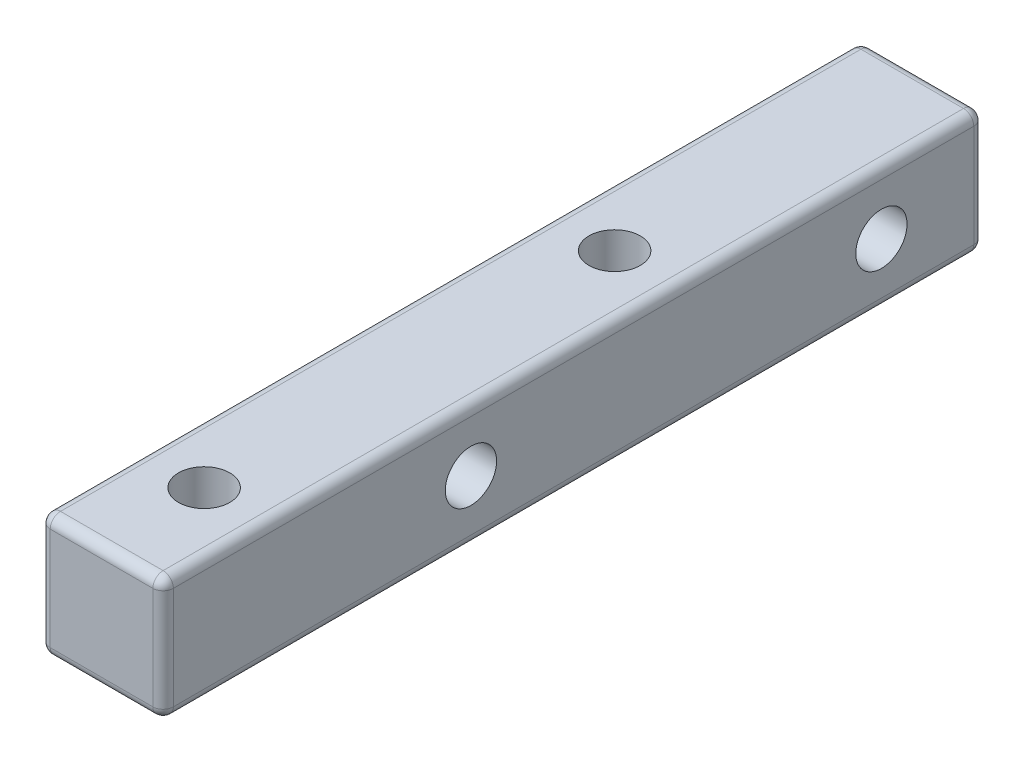
ISO-10303-21;
HEADER;
FILE_DESCRIPTION(('STEP AP214'),'2;1');
FILE_NAME('part.step','',(''),(''),'','','');
FILE_SCHEMA(('AUTOMOTIVE_DESIGN { 1 0 10303 214 1 1 1 1 }'));
ENDSEC;
DATA;
#1=APPLICATION_CONTEXT('core data for automotive mechanical design processes');
#2=APPLICATION_PROTOCOL_DEFINITION('international standard','automotive_design',2000,#1);
#3=PRODUCT_CONTEXT('',#1,'mechanical');
#4=PRODUCT('Part','Part','',(#3));
#5=PRODUCT_RELATED_PRODUCT_CATEGORY('part','',(#4));
#6=PRODUCT_DEFINITION_FORMATION('','',#4);
#7=PRODUCT_DEFINITION_CONTEXT('part definition',#1,'design');
#8=PRODUCT_DEFINITION('design','',#6,#7);
#9=PRODUCT_DEFINITION_SHAPE('','',#8);
#10=(LENGTH_UNIT() NAMED_UNIT(*) SI_UNIT(.MILLI.,.METRE.));
#11=(NAMED_UNIT(*) PLANE_ANGLE_UNIT() SI_UNIT($,.RADIAN.));
#12=(NAMED_UNIT(*) SI_UNIT($,.STERADIAN.) SOLID_ANGLE_UNIT());
#13=UNCERTAINTY_MEASURE_WITH_UNIT(LENGTH_MEASURE(1.E-05),#10,'distance_accuracy_value','');
#14=(GEOMETRIC_REPRESENTATION_CONTEXT(3) GLOBAL_UNCERTAINTY_ASSIGNED_CONTEXT((#13)) GLOBAL_UNIT_ASSIGNED_CONTEXT((#10,
#11,#12)) REPRESENTATION_CONTEXT('',''));
#15=CARTESIAN_POINT('',(0.,0.,0.));
#16=DIRECTION('',(0.,0.,1.));
#17=DIRECTION('',(1.,0.,0.));
#18=AXIS2_PLACEMENT_3D('',#15,#16,#17);
#19=CARTESIAN_POINT('',(3.,-3.,40.));
#20=DIRECTION('',(-1.,0.,0.));
#21=DIRECTION('',(0.,0.,1.));
#22=AXIS2_PLACEMENT_3D('',#19,#20,#21);
#23=PLANE('',#22);
#24=DIRECTION('',(0.,1.,0.));
#25=VECTOR('',#24,1.);
#26=CARTESIAN_POINT('',(3.,-3.,39.5));
#27=LINE('',#26,#25);
#28=CARTESIAN_POINT('',(3.,2.5,39.5));
#29=VERTEX_POINT('',#28);
#30=CARTESIAN_POINT('',(3.,-2.5,39.5));
#31=VERTEX_POINT('',#30);
#32=EDGE_CURVE('E205',#29,#31,#27,.F.);
#33=ORIENTED_EDGE('',*,*,#32,.T.);
#34=DIRECTION('',(0.,0.,-1.));
#35=VECTOR('',#34,1.);
#36=CARTESIAN_POINT('',(3.,-2.5,40.));
#37=LINE('',#36,#35);
#38=CARTESIAN_POINT('',(3.,-2.5,0.5));
#39=VERTEX_POINT('',#38);
#40=EDGE_CURVE('E208',#31,#39,#37,.T.);
#41=ORIENTED_EDGE('',*,*,#40,.T.);
#42=DIRECTION('',(0.,1.,0.));
#43=VECTOR('',#42,1.);
#44=CARTESIAN_POINT('',(3.,3.,0.5));
#45=LINE('',#44,#43);
#46=CARTESIAN_POINT('',(3.,2.5,0.5));
#47=VERTEX_POINT('',#46);
#48=EDGE_CURVE('E203',#39,#47,#45,.T.);
#49=ORIENTED_EDGE('',*,*,#48,.T.);
#50=DIRECTION('',(0.,0.,-1.));
#51=VECTOR('',#50,1.);
#52=CARTESIAN_POINT('',(3.,2.5,40.));
#53=LINE('',#52,#51);
#54=EDGE_CURVE('E201',#47,#29,#53,.F.);
#55=ORIENTED_EDGE('',*,*,#54,.T.);
#56=EDGE_LOOP('',(#33,#41,#49,#55));
#57=FACE_BOUND('',#56,.T.);
#58=CARTESIAN_POINT('',(3.,0.,5.));
#59=DIRECTION('',(-1.,0.,0.));
#60=DIRECTION('',(0.,0.,1.));
#61=AXIS2_PLACEMENT_3D('',#58,#59,#60);
#62=CIRCLE('',#61,1.25);
#63=CARTESIAN_POINT('',(3.,0.,6.25));
#64=VERTEX_POINT('',#63);
#65=EDGE_CURVE('E277',#64,#64,#62,.T.);
#66=ORIENTED_EDGE('',*,*,#65,.T.);
#67=EDGE_LOOP('',(#66));
#68=FACE_BOUND('',#67,.T.);
#69=CARTESIAN_POINT('',(3.,0.,25.));
#70=DIRECTION('',(-1.,0.,0.));
#71=DIRECTION('',(0.,0.,1.));
#72=AXIS2_PLACEMENT_3D('',#69,#70,#71);
#73=CIRCLE('',#72,1.25);
#74=CARTESIAN_POINT('',(3.,0.,26.25));
#75=VERTEX_POINT('',#74);
#76=EDGE_CURVE('E287',#75,#75,#73,.T.);
#77=ORIENTED_EDGE('',*,*,#76,.T.);
#78=EDGE_LOOP('',(#77));
#79=FACE_BOUND('',#78,.T.);
#80=ADVANCED_FACE('F48',(#57,#68,#79),#23,.F.);
#81=CARTESIAN_POINT('',(-3.,3.,40.));
#82=DIRECTION('',(0.,-1.,0.));
#83=DIRECTION('',(0.,0.,-1.));
#84=AXIS2_PLACEMENT_3D('',#81,#82,#83);
#85=PLANE('',#84);
#86=DIRECTION('',(-1.,0.,0.));
#87=VECTOR('',#86,1.);
#88=CARTESIAN_POINT('',(-3.,3.,39.5));
#89=LINE('',#88,#87);
#90=CARTESIAN_POINT('',(-2.5,3.,39.5));
#91=VERTEX_POINT('',#90);
#92=CARTESIAN_POINT('',(2.5,3.,39.5));
#93=VERTEX_POINT('',#92);
#94=EDGE_CURVE('E196',#91,#93,#89,.F.);
#95=ORIENTED_EDGE('',*,*,#94,.T.);
#96=DIRECTION('',(0.,0.,-1.));
#97=VECTOR('',#96,1.);
#98=CARTESIAN_POINT('',(2.5,3.,40.));
#99=LINE('',#98,#97);
#100=CARTESIAN_POINT('',(2.5,3.,0.5));
#101=VERTEX_POINT('',#100);
#102=EDGE_CURVE('E199',#93,#101,#99,.T.);
#103=ORIENTED_EDGE('',*,*,#102,.T.);
#104=DIRECTION('',(-1.,0.,0.));
#105=VECTOR('',#104,1.);
#106=CARTESIAN_POINT('',(-3.,3.,0.5));
#107=LINE('',#106,#105);
#108=CARTESIAN_POINT('',(-2.5,3.,0.5));
#109=VERTEX_POINT('',#108);
#110=EDGE_CURVE('E194',#101,#109,#107,.T.);
#111=ORIENTED_EDGE('',*,*,#110,.T.);
#112=DIRECTION('',(0.,0.,-1.));
#113=VECTOR('',#112,1.);
#114=CARTESIAN_POINT('',(-2.5,3.,40.));
#115=LINE('',#114,#113);
#116=EDGE_CURVE('E192',#109,#91,#115,.F.);
#117=ORIENTED_EDGE('',*,*,#116,.T.);
#118=EDGE_LOOP('',(#95,#103,#111,#117));
#119=FACE_BOUND('',#118,.T.);
#120=CARTESIAN_POINT('',(0.,3.,35.));
#121=DIRECTION('',(0.,1.,0.));
#122=DIRECTION('',(0.,0.,1.));
#123=AXIS2_PLACEMENT_3D('',#120,#121,#122);
#124=CIRCLE('',#123,1.24999999999999);
#125=CARTESIAN_POINT('',(0.,3.,36.25));
#126=VERTEX_POINT('',#125);
#127=EDGE_CURVE('E290',#126,#126,#124,.T.);
#128=ORIENTED_EDGE('',*,*,#127,.F.);
#129=EDGE_LOOP('',(#128));
#130=FACE_BOUND('',#129,.T.);
#131=CARTESIAN_POINT('',(0.,3.,15.));
#132=DIRECTION('',(0.,1.,0.));
#133=DIRECTION('',(0.,0.,1.));
#134=AXIS2_PLACEMENT_3D('',#131,#132,#133);
#135=CIRCLE('',#134,1.24999999999999);
#136=CARTESIAN_POINT('',(0.,3.,16.25));
#137=VERTEX_POINT('',#136);
#138=EDGE_CURVE('E296',#137,#137,#135,.T.);
#139=ORIENTED_EDGE('',*,*,#138,.F.);
#140=EDGE_LOOP('',(#139));
#141=FACE_BOUND('',#140,.T.);
#142=ADVANCED_FACE('F353',(#119,#130,#141),#85,.F.);
#143=CARTESIAN_POINT('',(-3.,-3.,40.));
#144=DIRECTION('',(1.,0.,0.));
#145=DIRECTION('',(0.,0.,-1.));
#146=AXIS2_PLACEMENT_3D('',#143,#144,#145);
#147=PLANE('',#146);
#148=DIRECTION('',(0.,-1.,0.));
#149=VECTOR('',#148,1.);
#150=CARTESIAN_POINT('',(-3.,-3.,0.5));
#151=LINE('',#150,#149);
#152=CARTESIAN_POINT('',(-3.,2.5,0.5));
#153=VERTEX_POINT('',#152);
#154=CARTESIAN_POINT('',(-3.,-2.5,0.5));
#155=VERTEX_POINT('',#154);
#156=EDGE_CURVE('E185',#153,#155,#151,.T.);
#157=ORIENTED_EDGE('',*,*,#156,.T.);
#158=DIRECTION('',(0.,0.,-1.));
#159=VECTOR('',#158,1.);
#160=CARTESIAN_POINT('',(-3.,-2.5,40.));
#161=LINE('',#160,#159);
#162=CARTESIAN_POINT('',(-3.,-2.5,39.5));
#163=VERTEX_POINT('',#162);
#164=EDGE_CURVE('E190',#155,#163,#161,.F.);
#165=ORIENTED_EDGE('',*,*,#164,.T.);
#166=DIRECTION('',(0.,-1.,0.));
#167=VECTOR('',#166,1.);
#168=CARTESIAN_POINT('',(-3.,-3.,39.5));
#169=LINE('',#168,#167);
#170=CARTESIAN_POINT('',(-3.,2.5,39.5));
#171=VERTEX_POINT('',#170);
#172=EDGE_CURVE('E187',#163,#171,#169,.F.);
#173=ORIENTED_EDGE('',*,*,#172,.T.);
#174=DIRECTION('',(0.,0.,-1.));
#175=VECTOR('',#174,1.);
#176=CARTESIAN_POINT('',(-3.,2.5,40.));
#177=LINE('',#176,#175);
#178=EDGE_CURVE('E183',#171,#153,#177,.T.);
#179=ORIENTED_EDGE('',*,*,#178,.T.);
#180=EDGE_LOOP('',(#157,#165,#173,#179));
#181=FACE_BOUND('',#180,.T.);
#182=CARTESIAN_POINT('',(-3.,0.,5.));
#183=DIRECTION('',(-1.,0.,0.));
#184=DIRECTION('',(0.,0.,1.));
#185=AXIS2_PLACEMENT_3D('',#182,#183,#184);
#186=CIRCLE('',#185,1.24999999999999);
#187=CARTESIAN_POINT('',(-3.,0.,6.24999999999999));
#188=VERTEX_POINT('',#187);
#189=EDGE_CURVE('E271',#188,#188,#186,.T.);
#190=ORIENTED_EDGE('',*,*,#189,.F.);
#191=EDGE_LOOP('',(#190));
#192=FACE_BOUND('',#191,.T.);
#193=CARTESIAN_POINT('',(-3.,0.,25.));
#194=DIRECTION('',(-1.,0.,0.));
#195=DIRECTION('',(0.,0.,1.));
#196=AXIS2_PLACEMENT_3D('',#193,#194,#195);
#197=CIRCLE('',#196,1.24999999999999);
#198=CARTESIAN_POINT('',(-3.,0.,26.25));
#199=VERTEX_POINT('',#198);
#200=EDGE_CURVE('E282',#199,#199,#197,.T.);
#201=ORIENTED_EDGE('',*,*,#200,.F.);
#202=EDGE_LOOP('',(#201));
#203=FACE_BOUND('',#202,.T.);
#204=ADVANCED_FACE('F358',(#181,#192,#203),#147,.F.);
#205=CARTESIAN_POINT('',(-3.,-3.,40.));
#206=DIRECTION('',(0.,1.,0.));
#207=DIRECTION('',(0.,0.,1.));
#208=AXIS2_PLACEMENT_3D('',#205,#206,#207);
#209=PLANE('',#208);
#210=DIRECTION('',(1.,0.,0.));
#211=VECTOR('',#210,1.);
#212=CARTESIAN_POINT('',(3.,-3.,0.5));
#213=LINE('',#212,#211);
#214=CARTESIAN_POINT('',(-2.5,-3.,0.5));
#215=VERTEX_POINT('',#214);
#216=CARTESIAN_POINT('',(2.5,-3.,0.5));
#217=VERTEX_POINT('',#216);
#218=EDGE_CURVE('E174',#215,#217,#213,.T.);
#219=ORIENTED_EDGE('',*,*,#218,.T.);
#220=DIRECTION('',(0.,0.,-1.));
#221=VECTOR('',#220,1.);
#222=CARTESIAN_POINT('',(2.5,-3.,40.));
#223=LINE('',#222,#221);
#224=CARTESIAN_POINT('',(2.5,-3.,39.5));
#225=VERTEX_POINT('',#224);
#226=EDGE_CURVE('E181',#217,#225,#223,.F.);
#227=ORIENTED_EDGE('',*,*,#226,.T.);
#228=DIRECTION('',(1.,0.,0.));
#229=VECTOR('',#228,1.);
#230=CARTESIAN_POINT('',(-3.,-3.,39.5));
#231=LINE('',#230,#229);
#232=CARTESIAN_POINT('',(-2.5,-3.,39.5));
#233=VERTEX_POINT('',#232);
#234=EDGE_CURVE('E143',#225,#233,#231,.F.);
#235=ORIENTED_EDGE('',*,*,#234,.T.);
#236=DIRECTION('',(0.,0.,-1.));
#237=VECTOR('',#236,1.);
#238=CARTESIAN_POINT('',(-2.5,-3.,40.));
#239=LINE('',#238,#237);
#240=EDGE_CURVE('E172',#233,#215,#239,.T.);
#241=ORIENTED_EDGE('',*,*,#240,.T.);
#242=EDGE_LOOP('',(#219,#227,#235,#241));
#243=FACE_BOUND('',#242,.T.);
#244=CARTESIAN_POINT('',(0.,-3.,35.));
#245=DIRECTION('',(0.,1.,0.));
#246=DIRECTION('',(0.,0.,1.));
#247=AXIS2_PLACEMENT_3D('',#244,#245,#246);
#248=CIRCLE('',#247,1.25);
#249=CARTESIAN_POINT('',(0.,-3.,36.25));
#250=VERTEX_POINT('',#249);
#251=EDGE_CURVE('E293',#250,#250,#248,.T.);
#252=ORIENTED_EDGE('',*,*,#251,.T.);
#253=EDGE_LOOP('',(#252));
#254=FACE_BOUND('',#253,.T.);
#255=CARTESIAN_POINT('',(0.,-3.,15.));
#256=DIRECTION('',(0.,1.,0.));
#257=DIRECTION('',(0.,0.,1.));
#258=AXIS2_PLACEMENT_3D('',#255,#256,#257);
#259=CIRCLE('',#258,1.25);
#260=CARTESIAN_POINT('',(0.,-3.,16.25));
#261=VERTEX_POINT('',#260);
#262=EDGE_CURVE('E166',#261,#261,#259,.T.);
#263=ORIENTED_EDGE('',*,*,#262,.T.);
#264=EDGE_LOOP('',(#263));
#265=FACE_BOUND('',#264,.T.);
#266=ADVANCED_FACE('F324',(#243,#254,#265),#209,.F.);
#267=CARTESIAN_POINT('',(0.,0.,40.));
#268=DIRECTION('',(0.,0.,-1.));
#269=DIRECTION('',(-1.,0.,0.));
#270=AXIS2_PLACEMENT_3D('',#267,#268,#269);
#271=PLANE('',#270);
#272=DIRECTION('',(0.,-1.,0.));
#273=VECTOR('',#272,1.);
#274=CARTESIAN_POINT('',(-2.5,0.,40.));
#275=LINE('',#274,#273);
#276=CARTESIAN_POINT('',(-2.5,2.5,40.));
#277=VERTEX_POINT('',#276);
#278=CARTESIAN_POINT('',(-2.5,-2.5,40.));
#279=VERTEX_POINT('',#278);
#280=EDGE_CURVE('E170',#277,#279,#275,.T.);
#281=ORIENTED_EDGE('',*,*,#280,.T.);
#282=DIRECTION('',(1.,0.,0.));
#283=VECTOR('',#282,1.);
#284=CARTESIAN_POINT('',(0.,-2.5,40.));
#285=LINE('',#284,#283);
#286=CARTESIAN_POINT('',(2.5,-2.5,40.));
#287=VERTEX_POINT('',#286);
#288=EDGE_CURVE('E141',#279,#287,#285,.T.);
#289=ORIENTED_EDGE('',*,*,#288,.T.);
#290=DIRECTION('',(0.,1.,0.));
#291=VECTOR('',#290,1.);
#292=CARTESIAN_POINT('',(2.5,0.,40.));
#293=LINE('',#292,#291);
#294=CARTESIAN_POINT('',(2.5,2.5,40.));
#295=VERTEX_POINT('',#294);
#296=EDGE_CURVE('E159',#287,#295,#293,.T.);
#297=ORIENTED_EDGE('',*,*,#296,.T.);
#298=DIRECTION('',(-1.,0.,0.));
#299=VECTOR('',#298,1.);
#300=CARTESIAN_POINT('',(0.,2.5,40.));
#301=LINE('',#300,#299);
#302=EDGE_CURVE('E165',#295,#277,#301,.T.);
#303=ORIENTED_EDGE('',*,*,#302,.T.);
#304=EDGE_LOOP('',(#281,#289,#297,#303));
#305=FACE_BOUND('',#304,.T.);
#306=ADVANCED_FACE('F168',(#305),#271,.F.);
#307=CARTESIAN_POINT('',(0.,0.,0.));
#308=DIRECTION('',(0.,0.,-1.));
#309=DIRECTION('',(-1.,0.,0.));
#310=AXIS2_PLACEMENT_3D('',#307,#308,#309);
#311=PLANE('',#310);
#312=DIRECTION('',(0.,-1.,0.));
#313=VECTOR('',#312,1.);
#314=CARTESIAN_POINT('',(-2.5,3.,0.));
#315=LINE('',#314,#313);
#316=CARTESIAN_POINT('',(-2.5,-2.5,0.));
#317=VERTEX_POINT('',#316);
#318=CARTESIAN_POINT('',(-2.5,2.5,0.));
#319=VERTEX_POINT('',#318);
#320=EDGE_CURVE('E57',#317,#319,#315,.F.);
#321=ORIENTED_EDGE('',*,*,#320,.T.);
#322=DIRECTION('',(-1.,0.,0.));
#323=VECTOR('',#322,1.);
#324=CARTESIAN_POINT('',(3.,2.5,0.));
#325=LINE('',#324,#323);
#326=CARTESIAN_POINT('',(2.5,2.5,0.));
#327=VERTEX_POINT('',#326);
#328=EDGE_CURVE('E13',#319,#327,#325,.F.);
#329=ORIENTED_EDGE('',*,*,#328,.T.);
#330=DIRECTION('',(0.,1.,0.));
#331=VECTOR('',#330,1.);
#332=CARTESIAN_POINT('',(2.5,-3.,0.));
#333=LINE('',#332,#331);
#334=CARTESIAN_POINT('',(2.5,-2.5,0.));
#335=VERTEX_POINT('',#334);
#336=EDGE_CURVE('E210',#327,#335,#333,.F.);
#337=ORIENTED_EDGE('',*,*,#336,.T.);
#338=DIRECTION('',(1.,0.,0.));
#339=VECTOR('',#338,1.);
#340=CARTESIAN_POINT('',(-3.,-2.5,0.));
#341=LINE('',#340,#339);
#342=EDGE_CURVE('E68',#335,#317,#341,.F.);
#343=ORIENTED_EDGE('',*,*,#342,.T.);
#344=EDGE_LOOP('',(#321,#329,#337,#343));
#345=FACE_BOUND('',#344,.T.);
#346=ADVANCED_FACE('F551',(#345),#311,.T.);
#347=CARTESIAN_POINT('',(0.,3.,15.));
#348=DIRECTION('',(0.,1.,0.));
#349=DIRECTION('',(0.,0.,1.));
#350=AXIS2_PLACEMENT_3D('',#347,#348,#349);
#351=CYLINDRICAL_SURFACE('',#350,1.24999999999999);
#352=ORIENTED_EDGE('',*,*,#262,.F.);
#353=EDGE_LOOP('',(#352));
#354=FACE_BOUND('',#353,.T.);
#355=ORIENTED_EDGE('',*,*,#138,.T.);
#356=EDGE_LOOP('',(#355));
#357=FACE_BOUND('',#356,.T.);
#358=ADVANCED_FACE('F541',(#354,#357),#351,.F.);
#359=CARTESIAN_POINT('',(0.,3.,35.));
#360=DIRECTION('',(0.,1.,0.));
#361=DIRECTION('',(0.,0.,1.));
#362=AXIS2_PLACEMENT_3D('',#359,#360,#361);
#363=CYLINDRICAL_SURFACE('',#362,1.24999999999999);
#364=ORIENTED_EDGE('',*,*,#251,.F.);
#365=EDGE_LOOP('',(#364));
#366=FACE_BOUND('',#365,.T.);
#367=ORIENTED_EDGE('',*,*,#127,.T.);
#368=EDGE_LOOP('',(#367));
#369=FACE_BOUND('',#368,.T.);
#370=ADVANCED_FACE('F531',(#366,#369),#363,.F.);
#371=CARTESIAN_POINT('',(-3.,0.,25.));
#372=DIRECTION('',(-1.,0.,0.));
#373=DIRECTION('',(0.,0.,1.));
#374=AXIS2_PLACEMENT_3D('',#371,#372,#373);
#375=CYLINDRICAL_SURFACE('',#374,1.24999999999999);
#376=ORIENTED_EDGE('',*,*,#76,.F.);
#377=EDGE_LOOP('',(#376));
#378=FACE_BOUND('',#377,.T.);
#379=ORIENTED_EDGE('',*,*,#200,.T.);
#380=EDGE_LOOP('',(#379));
#381=FACE_BOUND('',#380,.T.);
#382=ADVANCED_FACE('F521',(#378,#381),#375,.F.);
#383=CARTESIAN_POINT('',(-3.,0.,5.));
#384=DIRECTION('',(-1.,0.,0.));
#385=DIRECTION('',(0.,0.,1.));
#386=AXIS2_PLACEMENT_3D('',#383,#384,#385);
#387=CYLINDRICAL_SURFACE('',#386,1.24999999999999);
#388=ORIENTED_EDGE('',*,*,#65,.F.);
#389=EDGE_LOOP('',(#388));
#390=FACE_BOUND('',#389,.T.);
#391=ORIENTED_EDGE('',*,*,#189,.T.);
#392=EDGE_LOOP('',(#391));
#393=FACE_BOUND('',#392,.T.);
#394=ADVANCED_FACE('F512',(#390,#393),#387,.F.);
#395=CARTESIAN_POINT('',(-3.,2.5,0.5));
#396=DIRECTION('',(1.,0.,0.));
#397=DIRECTION('',(0.,0.,-1.));
#398=AXIS2_PLACEMENT_3D('',#395,#396,#397);
#399=CYLINDRICAL_SURFACE('',#398,0.5);
#400=CARTESIAN_POINT('',(-2.5,2.5,0.5));
#401=DIRECTION('',(-1.,0.,0.));
#402=DIRECTION('',(0.,0.,1.));
#403=AXIS2_PLACEMENT_3D('',#400,#401,#402);
#404=CIRCLE('',#403,0.5);
#405=EDGE_CURVE('E52',#109,#319,#404,.T.);
#406=ORIENTED_EDGE('',*,*,#405,.F.);
#407=ORIENTED_EDGE('',*,*,#110,.F.);
#408=CARTESIAN_POINT('',(2.5,2.5,0.5));
#409=DIRECTION('',(1.,0.,0.));
#410=DIRECTION('',(0.,1.,0.));
#411=AXIS2_PLACEMENT_3D('',#408,#409,#410);
#412=CIRCLE('',#411,0.5);
#413=EDGE_CURVE('E264',#327,#101,#412,.T.);
#414=ORIENTED_EDGE('',*,*,#413,.F.);
#415=ORIENTED_EDGE('',*,*,#328,.F.);
#416=EDGE_LOOP('',(#406,#407,#414,#415));
#417=FACE_BOUND('',#416,.T.);
#418=ADVANCED_FACE('F50',(#417),#399,.T.);
#419=CARTESIAN_POINT('',(-2.5,2.5,0.5));
#420=DIRECTION('',(0.,0.,1.));
#421=DIRECTION('',(1.,0.,0.));
#422=AXIS2_PLACEMENT_3D('',#419,#420,#421);
#423=SPHERICAL_SURFACE('',#422,0.5);
#424=CARTESIAN_POINT('',(-2.5,2.5,0.5));
#425=DIRECTION('',(0.,0.,-1.));
#426=DIRECTION('',(-1.,0.,0.));
#427=AXIS2_PLACEMENT_3D('',#424,#425,#426);
#428=CIRCLE('',#427,0.5);
#429=EDGE_CURVE('E259',#109,#153,#428,.F.);
#430=ORIENTED_EDGE('',*,*,#429,.F.);
#431=ORIENTED_EDGE('',*,*,#405,.T.);
#432=CARTESIAN_POINT('',(-2.5,2.5,0.5));
#433=DIRECTION('',(0.,1.,0.));
#434=DIRECTION('',(-1.,0.,0.));
#435=AXIS2_PLACEMENT_3D('',#432,#433,#434);
#436=CIRCLE('',#435,0.5);
#437=EDGE_CURVE('E262',#153,#319,#436,.F.);
#438=ORIENTED_EDGE('',*,*,#437,.F.);
#439=EDGE_LOOP('',(#430,#431,#438));
#440=FACE_BOUND('',#439,.T.);
#441=ADVANCED_FACE('F498',(#440),#423,.T.);
#442=CARTESIAN_POINT('',(2.5,2.5,0.5));
#443=DIRECTION('',(0.,0.,1.));
#444=DIRECTION('',(1.,0.,0.));
#445=AXIS2_PLACEMENT_3D('',#442,#443,#444);
#446=SPHERICAL_SURFACE('',#445,0.5);
#447=CARTESIAN_POINT('',(2.5,2.5,0.5));
#448=DIRECTION('',(0.,1.,0.));
#449=DIRECTION('',(0.,0.,1.));
#450=AXIS2_PLACEMENT_3D('',#447,#448,#449);
#451=CIRCLE('',#450,0.5);
#452=EDGE_CURVE('E253',#327,#47,#451,.F.);
#453=ORIENTED_EDGE('',*,*,#452,.F.);
#454=ORIENTED_EDGE('',*,*,#413,.T.);
#455=CARTESIAN_POINT('',(2.5,2.5,0.5));
#456=DIRECTION('',(0.,0.,-1.));
#457=DIRECTION('',(-1.,0.,0.));
#458=AXIS2_PLACEMENT_3D('',#455,#456,#457);
#459=CIRCLE('',#458,0.5);
#460=EDGE_CURVE('E256',#47,#101,#459,.F.);
#461=ORIENTED_EDGE('',*,*,#460,.F.);
#462=EDGE_LOOP('',(#453,#454,#461));
#463=FACE_BOUND('',#462,.T.);
#464=ADVANCED_FACE('F489',(#463),#446,.T.);
#465=CARTESIAN_POINT('',(-2.5,-3.,0.5));
#466=DIRECTION('',(0.,1.,0.));
#467=DIRECTION('',(0.,0.,1.));
#468=AXIS2_PLACEMENT_3D('',#465,#466,#467);
#469=CYLINDRICAL_SURFACE('',#468,0.5);
#470=ORIENTED_EDGE('',*,*,#437,.T.);
#471=ORIENTED_EDGE('',*,*,#320,.F.);
#472=CARTESIAN_POINT('',(-2.5,-2.5,0.5));
#473=DIRECTION('',(0.,-1.,0.));
#474=DIRECTION('',(0.,0.,-1.));
#475=AXIS2_PLACEMENT_3D('',#472,#473,#474);
#476=CIRCLE('',#475,0.5);
#477=EDGE_CURVE('E247',#155,#317,#476,.T.);
#478=ORIENTED_EDGE('',*,*,#477,.F.);
#479=ORIENTED_EDGE('',*,*,#156,.F.);
#480=EDGE_LOOP('',(#470,#471,#478,#479));
#481=FACE_BOUND('',#480,.T.);
#482=ADVANCED_FACE('F480',(#481),#469,.T.);
#483=CARTESIAN_POINT('',(-2.5,2.5,40.));
#484=DIRECTION('',(0.,0.,-1.));
#485=DIRECTION('',(-1.,0.,0.));
#486=AXIS2_PLACEMENT_3D('',#483,#484,#485);
#487=CYLINDRICAL_SURFACE('',#486,0.5);
#488=ORIENTED_EDGE('',*,*,#429,.T.);
#489=ORIENTED_EDGE('',*,*,#178,.F.);
#490=CARTESIAN_POINT('',(-2.5,2.5,39.5));
#491=DIRECTION('',(0.,0.,1.));
#492=DIRECTION('',(1.,0.,0.));
#493=AXIS2_PLACEMENT_3D('',#490,#491,#492);
#494=CIRCLE('',#493,0.5);
#495=EDGE_CURVE('E244',#91,#171,#494,.T.);
#496=ORIENTED_EDGE('',*,*,#495,.F.);
#497=ORIENTED_EDGE('',*,*,#116,.F.);
#498=EDGE_LOOP('',(#488,#489,#496,#497));
#499=FACE_BOUND('',#498,.T.);
#500=ADVANCED_FACE('F472',(#499),#487,.T.);
#501=CARTESIAN_POINT('',(0.,2.5,39.5));
#502=DIRECTION('',(-1.,0.,0.));
#503=DIRECTION('',(0.,0.,1.));
#504=AXIS2_PLACEMENT_3D('',#501,#502,#503);
#505=CYLINDRICAL_SURFACE('',#504,0.5);
#506=CARTESIAN_POINT('',(2.5,2.5,39.5));
#507=DIRECTION('',(1.,0.,0.));
#508=DIRECTION('',(0.,0.,-1.));
#509=AXIS2_PLACEMENT_3D('',#506,#507,#508);
#510=CIRCLE('',#509,0.5);
#511=EDGE_CURVE('E238',#93,#295,#510,.T.);
#512=ORIENTED_EDGE('',*,*,#511,.F.);
#513=ORIENTED_EDGE('',*,*,#94,.F.);
#514=CARTESIAN_POINT('',(-2.5,2.5,39.5));
#515=DIRECTION('',(-1.,0.,0.));
#516=DIRECTION('',(0.,0.,1.));
#517=AXIS2_PLACEMENT_3D('',#514,#515,#516);
#518=CIRCLE('',#517,0.5);
#519=EDGE_CURVE('E241',#277,#91,#518,.T.);
#520=ORIENTED_EDGE('',*,*,#519,.F.);
#521=ORIENTED_EDGE('',*,*,#302,.F.);
#522=EDGE_LOOP('',(#512,#513,#520,#521));
#523=FACE_BOUND('',#522,.T.);
#524=ADVANCED_FACE('F305',(#523),#505,.T.);
#525=CARTESIAN_POINT('',(2.5,2.5,40.));
#526=DIRECTION('',(0.,0.,-1.));
#527=DIRECTION('',(-1.,0.,0.));
#528=AXIS2_PLACEMENT_3D('',#525,#526,#527);
#529=CYLINDRICAL_SURFACE('',#528,0.5);
#530=ORIENTED_EDGE('',*,*,#460,.T.);
#531=ORIENTED_EDGE('',*,*,#102,.F.);
#532=CARTESIAN_POINT('',(2.5,2.5,39.5));
#533=DIRECTION('',(0.,0.,1.));
#534=DIRECTION('',(1.,0.,0.));
#535=AXIS2_PLACEMENT_3D('',#532,#533,#534);
#536=CIRCLE('',#535,0.5);
#537=EDGE_CURVE('E236',#29,#93,#536,.T.);
#538=ORIENTED_EDGE('',*,*,#537,.F.);
#539=ORIENTED_EDGE('',*,*,#54,.F.);
#540=EDGE_LOOP('',(#530,#531,#538,#539));
#541=FACE_BOUND('',#540,.T.);
#542=ADVANCED_FACE('F338',(#541),#529,.T.);
#543=CARTESIAN_POINT('',(2.5,-3.,0.5));
#544=DIRECTION('',(0.,-1.,0.));
#545=DIRECTION('',(0.,0.,-1.));
#546=AXIS2_PLACEMENT_3D('',#543,#544,#545);
#547=CYLINDRICAL_SURFACE('',#546,0.5);
#548=ORIENTED_EDGE('',*,*,#452,.T.);
#549=ORIENTED_EDGE('',*,*,#48,.F.);
#550=CARTESIAN_POINT('',(2.5,-2.5,0.5));
#551=DIRECTION('',(0.,-1.,0.));
#552=DIRECTION('',(0.,0.,-1.));
#553=AXIS2_PLACEMENT_3D('',#550,#551,#552);
#554=CIRCLE('',#553,0.5);
#555=EDGE_CURVE('E233',#335,#39,#554,.T.);
#556=ORIENTED_EDGE('',*,*,#555,.F.);
#557=ORIENTED_EDGE('',*,*,#336,.F.);
#558=EDGE_LOOP('',(#548,#549,#556,#557));
#559=FACE_BOUND('',#558,.T.);
#560=ADVANCED_FACE('F448',(#559),#547,.T.);
#561=CARTESIAN_POINT('',(-3.,-2.5,0.5));
#562=DIRECTION('',(-1.,0.,0.));
#563=DIRECTION('',(0.,0.,1.));
#564=AXIS2_PLACEMENT_3D('',#561,#562,#563);
#565=CYLINDRICAL_SURFACE('',#564,0.5);
#566=CARTESIAN_POINT('',(-2.5,-2.5,0.5));
#567=DIRECTION('',(-1.,0.,0.));
#568=DIRECTION('',(0.,0.,1.));
#569=AXIS2_PLACEMENT_3D('',#566,#567,#568);
#570=CIRCLE('',#569,0.5);
#571=EDGE_CURVE('E250',#317,#215,#570,.T.);
#572=ORIENTED_EDGE('',*,*,#571,.F.);
#573=ORIENTED_EDGE('',*,*,#342,.F.);
#574=CARTESIAN_POINT('',(2.5,-2.5,0.5));
#575=DIRECTION('',(1.,0.,0.));
#576=DIRECTION('',(0.,0.,-1.));
#577=AXIS2_PLACEMENT_3D('',#574,#575,#576);
#578=CIRCLE('',#577,0.5);
#579=EDGE_CURVE('E230',#217,#335,#578,.T.);
#580=ORIENTED_EDGE('',*,*,#579,.F.);
#581=ORIENTED_EDGE('',*,*,#218,.F.);
#582=EDGE_LOOP('',(#572,#573,#580,#581));
#583=FACE_BOUND('',#582,.T.);
#584=ADVANCED_FACE('F439',(#583),#565,.T.);
#585=CARTESIAN_POINT('',(-2.5,-2.5,0.5));
#586=DIRECTION('',(0.,0.,1.));
#587=DIRECTION('',(1.,0.,0.));
#588=AXIS2_PLACEMENT_3D('',#585,#586,#587);
#589=SPHERICAL_SURFACE('',#588,0.5);
#590=ORIENTED_EDGE('',*,*,#477,.T.);
#591=ORIENTED_EDGE('',*,*,#571,.T.);
#592=CARTESIAN_POINT('',(-2.5,-2.5,0.5));
#593=DIRECTION('',(0.,0.,-1.));
#594=DIRECTION('',(-1.,0.,0.));
#595=AXIS2_PLACEMENT_3D('',#592,#593,#594);
#596=CIRCLE('',#595,0.5);
#597=EDGE_CURVE('E227',#155,#215,#596,.F.);
#598=ORIENTED_EDGE('',*,*,#597,.F.);
#599=EDGE_LOOP('',(#590,#591,#598));
#600=FACE_BOUND('',#599,.T.);
#601=ADVANCED_FACE('F350',(#600),#589,.T.);
#602=CARTESIAN_POINT('',(-2.5,2.5,39.5));
#603=DIRECTION('',(0.,0.,1.));
#604=DIRECTION('',(1.,0.,0.));
#605=AXIS2_PLACEMENT_3D('',#602,#603,#604);
#606=SPHERICAL_SURFACE('',#605,0.5);
#607=ORIENTED_EDGE('',*,*,#519,.T.);
#608=ORIENTED_EDGE('',*,*,#495,.T.);
#609=CARTESIAN_POINT('',(-2.5,2.5,39.5));
#610=DIRECTION('',(0.,1.,0.));
#611=DIRECTION('',(0.,0.,1.));
#612=AXIS2_PLACEMENT_3D('',#609,#610,#611);
#613=CIRCLE('',#612,0.5);
#614=EDGE_CURVE('E225',#277,#171,#613,.F.);
#615=ORIENTED_EDGE('',*,*,#614,.F.);
#616=EDGE_LOOP('',(#607,#608,#615));
#617=FACE_BOUND('',#616,.T.);
#618=ADVANCED_FACE('F308',(#617),#606,.T.);
#619=CARTESIAN_POINT('',(2.5,2.5,39.5));
#620=DIRECTION('',(0.,0.,1.));
#621=DIRECTION('',(1.,0.,0.));
#622=AXIS2_PLACEMENT_3D('',#619,#620,#621);
#623=SPHERICAL_SURFACE('',#622,0.5);
#624=ORIENTED_EDGE('',*,*,#537,.T.);
#625=ORIENTED_EDGE('',*,*,#511,.T.);
#626=CARTESIAN_POINT('',(2.5,2.5,39.5));
#627=DIRECTION('',(0.,1.,0.));
#628=DIRECTION('',(0.,0.,1.));
#629=AXIS2_PLACEMENT_3D('',#626,#627,#628);
#630=CIRCLE('',#629,0.5);
#631=EDGE_CURVE('E162',#29,#295,#630,.F.);
#632=ORIENTED_EDGE('',*,*,#631,.F.);
#633=EDGE_LOOP('',(#624,#625,#632));
#634=FACE_BOUND('',#633,.T.);
#635=ADVANCED_FACE('F340',(#634),#623,.T.);
#636=CARTESIAN_POINT('',(2.5,-2.5,0.5));
#637=DIRECTION('',(0.,0.,1.));
#638=DIRECTION('',(1.,0.,0.));
#639=AXIS2_PLACEMENT_3D('',#636,#637,#638);
#640=SPHERICAL_SURFACE('',#639,0.5);
#641=ORIENTED_EDGE('',*,*,#579,.T.);
#642=ORIENTED_EDGE('',*,*,#555,.T.);
#643=CARTESIAN_POINT('',(2.5,-2.5,0.5));
#644=DIRECTION('',(0.,0.,-1.));
#645=DIRECTION('',(-1.,0.,0.));
#646=AXIS2_PLACEMENT_3D('',#643,#644,#645);
#647=CIRCLE('',#646,0.5);
#648=EDGE_CURVE('E221',#217,#39,#647,.F.);
#649=ORIENTED_EDGE('',*,*,#648,.F.);
#650=EDGE_LOOP('',(#641,#642,#649));
#651=FACE_BOUND('',#650,.T.);
#652=ADVANCED_FACE('F342',(#651),#640,.T.);
#653=CARTESIAN_POINT('',(-2.5,-2.5,40.));
#654=DIRECTION('',(0.,0.,-1.));
#655=DIRECTION('',(-1.,0.,0.));
#656=AXIS2_PLACEMENT_3D('',#653,#654,#655);
#657=CYLINDRICAL_SURFACE('',#656,0.5);
#658=ORIENTED_EDGE('',*,*,#597,.T.);
#659=ORIENTED_EDGE('',*,*,#240,.F.);
#660=CARTESIAN_POINT('',(-2.5,-2.5,39.5));
#661=DIRECTION('',(0.,0.,1.));
#662=DIRECTION('',(1.,0.,0.));
#663=AXIS2_PLACEMENT_3D('',#660,#661,#662);
#664=CIRCLE('',#663,0.5);
#665=EDGE_CURVE('E218',#163,#233,#664,.T.);
#666=ORIENTED_EDGE('',*,*,#665,.F.);
#667=ORIENTED_EDGE('',*,*,#164,.F.);
#668=EDGE_LOOP('',(#658,#659,#666,#667));
#669=FACE_BOUND('',#668,.T.);
#670=ADVANCED_FACE('F320',(#669),#657,.T.);
#671=CARTESIAN_POINT('',(-2.5,0.,39.5));
#672=DIRECTION('',(0.,-1.,0.));
#673=DIRECTION('',(0.,0.,-1.));
#674=AXIS2_PLACEMENT_3D('',#671,#672,#673);
#675=CYLINDRICAL_SURFACE('',#674,0.5);
#676=ORIENTED_EDGE('',*,*,#614,.T.);
#677=ORIENTED_EDGE('',*,*,#172,.F.);
#678=CARTESIAN_POINT('',(-2.5,-2.5,39.5));
#679=DIRECTION('',(0.,-1.,0.));
#680=DIRECTION('',(0.,0.,-1.));
#681=AXIS2_PLACEMENT_3D('',#678,#679,#680);
#682=CIRCLE('',#681,0.5);
#683=EDGE_CURVE('E156',#279,#163,#682,.T.);
#684=ORIENTED_EDGE('',*,*,#683,.F.);
#685=ORIENTED_EDGE('',*,*,#280,.F.);
#686=EDGE_LOOP('',(#676,#677,#684,#685));
#687=FACE_BOUND('',#686,.T.);
#688=ADVANCED_FACE('F312',(#687),#675,.T.);
#689=CARTESIAN_POINT('',(2.5,0.,39.5));
#690=DIRECTION('',(0.,1.,0.));
#691=DIRECTION('',(0.,0.,1.));
#692=AXIS2_PLACEMENT_3D('',#689,#690,#691);
#693=CYLINDRICAL_SURFACE('',#692,0.5);
#694=ORIENTED_EDGE('',*,*,#631,.T.);
#695=ORIENTED_EDGE('',*,*,#296,.F.);
#696=CARTESIAN_POINT('',(2.5,-2.5,39.5));
#697=DIRECTION('',(0.,-1.,0.));
#698=DIRECTION('',(0.,0.,-1.));
#699=AXIS2_PLACEMENT_3D('',#696,#697,#698);
#700=CIRCLE('',#699,0.5);
#701=EDGE_CURVE('E148',#31,#287,#700,.T.);
#702=ORIENTED_EDGE('',*,*,#701,.F.);
#703=ORIENTED_EDGE('',*,*,#32,.F.);
#704=EDGE_LOOP('',(#694,#695,#702,#703));
#705=FACE_BOUND('',#704,.T.);
#706=ADVANCED_FACE('F160',(#705),#693,.T.);
#707=CARTESIAN_POINT('',(2.5,-2.5,40.));
#708=DIRECTION('',(0.,0.,-1.));
#709=DIRECTION('',(-1.,0.,0.));
#710=AXIS2_PLACEMENT_3D('',#707,#708,#709);
#711=CYLINDRICAL_SURFACE('',#710,0.5);
#712=ORIENTED_EDGE('',*,*,#648,.T.);
#713=ORIENTED_EDGE('',*,*,#40,.F.);
#714=CARTESIAN_POINT('',(2.5,-2.5,39.5));
#715=DIRECTION('',(0.,0.,1.));
#716=DIRECTION('',(1.,0.,0.));
#717=AXIS2_PLACEMENT_3D('',#714,#715,#716);
#718=CIRCLE('',#717,0.5);
#719=EDGE_CURVE('E152',#225,#31,#718,.T.);
#720=ORIENTED_EDGE('',*,*,#719,.F.);
#721=ORIENTED_EDGE('',*,*,#226,.F.);
#722=EDGE_LOOP('',(#712,#713,#720,#721));
#723=FACE_BOUND('',#722,.T.);
#724=ADVANCED_FACE('F329',(#723),#711,.T.);
#725=CARTESIAN_POINT('',(-2.5,-2.5,39.5));
#726=DIRECTION('',(0.,0.,1.));
#727=DIRECTION('',(1.,0.,0.));
#728=AXIS2_PLACEMENT_3D('',#725,#726,#727);
#729=SPHERICAL_SURFACE('',#728,0.5);
#730=ORIENTED_EDGE('',*,*,#683,.T.);
#731=ORIENTED_EDGE('',*,*,#665,.T.);
#732=CARTESIAN_POINT('',(-2.5,-2.5,39.5));
#733=DIRECTION('',(-1.,0.,0.));
#734=DIRECTION('',(0.,0.,1.));
#735=AXIS2_PLACEMENT_3D('',#732,#733,#734);
#736=CIRCLE('',#735,0.5);
#737=EDGE_CURVE('E145',#279,#233,#736,.F.);
#738=ORIENTED_EDGE('',*,*,#737,.F.);
#739=EDGE_LOOP('',(#730,#731,#738));
#740=FACE_BOUND('',#739,.T.);
#741=ADVANCED_FACE('F316',(#740),#729,.T.);
#742=CARTESIAN_POINT('',(2.5,-2.5,39.5));
#743=DIRECTION('',(0.,0.,1.));
#744=DIRECTION('',(1.,0.,0.));
#745=AXIS2_PLACEMENT_3D('',#742,#743,#744);
#746=SPHERICAL_SURFACE('',#745,0.5);
#747=ORIENTED_EDGE('',*,*,#719,.T.);
#748=ORIENTED_EDGE('',*,*,#701,.T.);
#749=CARTESIAN_POINT('',(2.5,-2.5,39.5));
#750=DIRECTION('',(1.,0.,0.));
#751=DIRECTION('',(0.,0.,-1.));
#752=AXIS2_PLACEMENT_3D('',#749,#750,#751);
#753=CIRCLE('',#752,0.5);
#754=EDGE_CURVE('E137',#225,#287,#753,.F.);
#755=ORIENTED_EDGE('',*,*,#754,.F.);
#756=EDGE_LOOP('',(#747,#748,#755));
#757=FACE_BOUND('',#756,.T.);
#758=ADVANCED_FACE('F150',(#757),#746,.T.);
#759=CARTESIAN_POINT('',(0.,-2.5,39.5));
#760=DIRECTION('',(1.,0.,0.));
#761=DIRECTION('',(0.,0.,-1.));
#762=AXIS2_PLACEMENT_3D('',#759,#760,#761);
#763=CYLINDRICAL_SURFACE('',#762,0.5);
#764=ORIENTED_EDGE('',*,*,#737,.T.);
#765=ORIENTED_EDGE('',*,*,#234,.F.);
#766=ORIENTED_EDGE('',*,*,#754,.T.);
#767=ORIENTED_EDGE('',*,*,#288,.F.);
#768=EDGE_LOOP('',(#764,#765,#766,#767));
#769=FACE_BOUND('',#768,.T.);
#770=ADVANCED_FACE('F139',(#769),#763,.T.);
#771=CLOSED_SHELL('',(#80,#142,#204,#266,#306,#346,#358,#370,#382,#394,#418,#441,#464,#482,#500,
#524,#542,#560,#584,#601,#618,#635,#652,#670,#688,#706,#724,#741,#758,#770));
#772=MANIFOLD_SOLID_BREP('B2',#771);
#773=ADVANCED_BREP_SHAPE_REPRESENTATION('',(#18,#772),#14);
#774=SHAPE_DEFINITION_REPRESENTATION(#9,#773);
ENDSEC;
END-ISO-10303-21;
